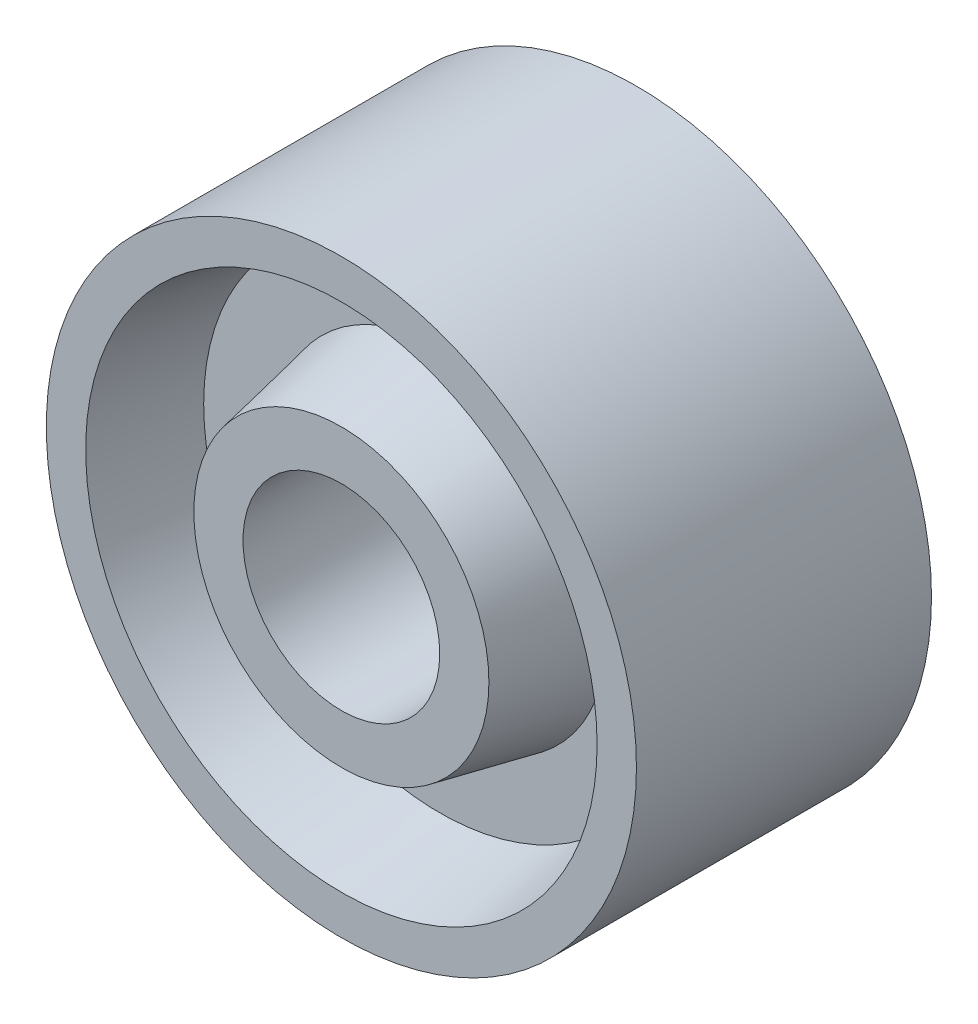
ISO-10303-21;
HEADER;
FILE_DESCRIPTION(('STEP AP214'),'2;1');
FILE_NAME('part.step','',(''),(''),'','','');
FILE_SCHEMA(('AUTOMOTIVE_DESIGN { 1 0 10303 214 1 1 1 1 }'));
ENDSEC;
DATA;
#1=APPLICATION_CONTEXT('core data for automotive mechanical design processes');
#2=APPLICATION_PROTOCOL_DEFINITION('international standard','automotive_design',2000,#1);
#3=PRODUCT_CONTEXT('',#1,'mechanical');
#4=PRODUCT('Part','Part','',(#3));
#5=PRODUCT_RELATED_PRODUCT_CATEGORY('part','',(#4));
#6=PRODUCT_DEFINITION_FORMATION('','',#4);
#7=PRODUCT_DEFINITION_CONTEXT('part definition',#1,'design');
#8=PRODUCT_DEFINITION('design','',#6,#7);
#9=PRODUCT_DEFINITION_SHAPE('','',#8);
#10=(LENGTH_UNIT() NAMED_UNIT(*) SI_UNIT(.MILLI.,.METRE.));
#11=(NAMED_UNIT(*) PLANE_ANGLE_UNIT() SI_UNIT($,.RADIAN.));
#12=(NAMED_UNIT(*) SI_UNIT($,.STERADIAN.) SOLID_ANGLE_UNIT());
#13=UNCERTAINTY_MEASURE_WITH_UNIT(LENGTH_MEASURE(1.E-05),#10,'distance_accuracy_value','');
#14=(GEOMETRIC_REPRESENTATION_CONTEXT(3) GLOBAL_UNCERTAINTY_ASSIGNED_CONTEXT((#13)) GLOBAL_UNIT_ASSIGNED_CONTEXT((#10,
#11,#12)) REPRESENTATION_CONTEXT('',''));
#15=CARTESIAN_POINT('',(0.,0.,0.));
#16=DIRECTION('',(0.,0.,1.));
#17=DIRECTION('',(1.,0.,0.));
#18=AXIS2_PLACEMENT_3D('',#15,#16,#17);
#19=CARTESIAN_POINT('',(0.,10.,-25.0704225352113));
#20=DIRECTION('',(0.,0.,1.));
#21=DIRECTION('',(1.,0.,0.));
#22=AXIS2_PLACEMENT_3D('',#19,#20,#21);
#23=PLANE('',#22);
#24=CARTESIAN_POINT('',(0.,0.,-25.0704225352113));
#25=DIRECTION('',(0.,0.,1.));
#26=DIRECTION('',(1.,0.,0.));
#27=AXIS2_PLACEMENT_3D('',#24,#25,#26);
#28=CIRCLE('',#27,15.);
#29=CARTESIAN_POINT('',(15.,0.,-25.0704225352113));
#30=VERTEX_POINT('',#29);
#31=EDGE_CURVE('E10',#30,#30,#28,.T.);
#32=ORIENTED_EDGE('',*,*,#31,.F.);
#33=EDGE_LOOP('',(#32));
#34=FACE_BOUND('',#33,.T.);
#35=CARTESIAN_POINT('',(0.,0.,-25.0704225352113));
#36=DIRECTION('',(0.,0.,1.));
#37=DIRECTION('',(1.,0.,0.));
#38=AXIS2_PLACEMENT_3D('',#35,#36,#37);
#39=CIRCLE('',#38,10.);
#40=CARTESIAN_POINT('',(10.,0.,-25.0704225352113));
#41=VERTEX_POINT('',#40);
#42=EDGE_CURVE('E94',#41,#41,#39,.T.);
#43=ORIENTED_EDGE('',*,*,#42,.T.);
#44=EDGE_LOOP('',(#43));
#45=FACE_BOUND('',#44,.T.);
#46=ADVANCED_FACE('F43',(#34,#45),#23,.F.);
#47=CARTESIAN_POINT('',(0.,0.,-25.0704225352113));
#48=DIRECTION('',(0.,0.,1.));
#49=DIRECTION('',(1.,0.,0.));
#50=AXIS2_PLACEMENT_3D('',#47,#48,#49);
#51=CONICAL_SURFACE('',#50,15.,0.197395559849881);
#52=CARTESIAN_POINT('',(0.,0.,-15.0704225352112));
#53=DIRECTION('',(0.,0.,1.));
#54=DIRECTION('',(1.,0.,0.));
#55=AXIS2_PLACEMENT_3D('',#52,#53,#54);
#56=CIRCLE('',#55,17.);
#57=CARTESIAN_POINT('',(17.,0.,-15.0704225352112));
#58=VERTEX_POINT('',#57);
#59=EDGE_CURVE('E50',#58,#58,#56,.T.);
#60=ORIENTED_EDGE('',*,*,#59,.F.);
#61=EDGE_LOOP('',(#60));
#62=FACE_BOUND('',#61,.T.);
#63=ORIENTED_EDGE('',*,*,#31,.T.);
#64=EDGE_LOOP('',(#63));
#65=FACE_BOUND('',#64,.T.);
#66=ADVANCED_FACE('F156',(#62,#65),#51,.T.);
#67=CARTESIAN_POINT('',(0.,17.,-15.0704225352112));
#68=DIRECTION('',(0.,0.,1.));
#69=DIRECTION('',(1.,0.,0.));
#70=AXIS2_PLACEMENT_3D('',#67,#68,#69);
#71=PLANE('',#70);
#72=CARTESIAN_POINT('',(0.,0.,-15.0704225352113));
#73=DIRECTION('',(0.,0.,1.));
#74=DIRECTION('',(1.,0.,0.));
#75=AXIS2_PLACEMENT_3D('',#72,#73,#74);
#76=CIRCLE('',#75,24.);
#77=CARTESIAN_POINT('',(24.,0.,-15.0704225352113));
#78=VERTEX_POINT('',#77);
#79=EDGE_CURVE('E55',#78,#78,#76,.T.);
#80=ORIENTED_EDGE('',*,*,#79,.F.);
#81=EDGE_LOOP('',(#80));
#82=FACE_BOUND('',#81,.T.);
#83=ORIENTED_EDGE('',*,*,#59,.T.);
#84=EDGE_LOOP('',(#83));
#85=FACE_BOUND('',#84,.T.);
#86=ADVANCED_FACE('F151',(#82,#85),#71,.F.);
#87=CARTESIAN_POINT('',(0.,0.,-15.0704225352113));
#88=DIRECTION('',(0.,0.,-1.));
#89=DIRECTION('',(-1.,0.,0.));
#90=AXIS2_PLACEMENT_3D('',#87,#88,#89);
#91=CONICAL_SURFACE('',#90,24.,0.197395559849881);
#92=CARTESIAN_POINT('',(0.,0.,-25.0704225352112));
#93=DIRECTION('',(0.,0.,1.));
#94=DIRECTION('',(1.,0.,0.));
#95=AXIS2_PLACEMENT_3D('',#92,#93,#94);
#96=CIRCLE('',#95,26.);
#97=CARTESIAN_POINT('',(26.,0.,-25.0704225352112));
#98=VERTEX_POINT('',#97);
#99=EDGE_CURVE('E60',#98,#98,#96,.T.);
#100=ORIENTED_EDGE('',*,*,#99,.F.);
#101=EDGE_LOOP('',(#100));
#102=FACE_BOUND('',#101,.T.);
#103=ORIENTED_EDGE('',*,*,#79,.T.);
#104=EDGE_LOOP('',(#103));
#105=FACE_BOUND('',#104,.T.);
#106=ADVANCED_FACE('F145',(#102,#105),#91,.F.);
#107=CARTESIAN_POINT('',(0.,26.,-25.0704225352112));
#108=DIRECTION('',(0.,0.,1.));
#109=DIRECTION('',(1.,0.,0.));
#110=AXIS2_PLACEMENT_3D('',#107,#108,#109);
#111=PLANE('',#110);
#112=CARTESIAN_POINT('',(0.,0.,-25.0704225352112));
#113=DIRECTION('',(0.,0.,1.));
#114=DIRECTION('',(1.,0.,0.));
#115=AXIS2_PLACEMENT_3D('',#112,#113,#114);
#116=CIRCLE('',#115,30.);
#117=CARTESIAN_POINT('',(30.,0.,-25.0704225352112));
#118=VERTEX_POINT('',#117);
#119=EDGE_CURVE('E66',#118,#118,#116,.T.);
#120=ORIENTED_EDGE('',*,*,#119,.F.);
#121=EDGE_LOOP('',(#120));
#122=FACE_BOUND('',#121,.T.);
#123=ORIENTED_EDGE('',*,*,#99,.T.);
#124=EDGE_LOOP('',(#123));
#125=FACE_BOUND('',#124,.T.);
#126=ADVANCED_FACE('F139',(#122,#125),#111,.F.);
#127=CARTESIAN_POINT('',(0.,0.,34.9295774647887));
#128=DIRECTION('',(0.,0.,1.));
#129=DIRECTION('',(1.,0.,0.));
#130=AXIS2_PLACEMENT_3D('',#127,#128,#129);
#131=CYLINDRICAL_SURFACE('',#130,30.);
#132=CARTESIAN_POINT('',(0.,0.,4.92957746478875));
#133=DIRECTION('',(0.,0.,1.));
#134=DIRECTION('',(1.,0.,0.));
#135=AXIS2_PLACEMENT_3D('',#132,#133,#134);
#136=CIRCLE('',#135,30.);
#137=CARTESIAN_POINT('',(30.,0.,4.92957746478875));
#138=VERTEX_POINT('',#137);
#139=EDGE_CURVE('E70',#138,#138,#136,.T.);
#140=ORIENTED_EDGE('',*,*,#139,.F.);
#141=EDGE_LOOP('',(#140));
#142=FACE_BOUND('',#141,.T.);
#143=ORIENTED_EDGE('',*,*,#119,.T.);
#144=EDGE_LOOP('',(#143));
#145=FACE_BOUND('',#144,.T.);
#146=ADVANCED_FACE('F133',(#142,#145),#131,.T.);
#147=CARTESIAN_POINT('',(0.,26.,4.92957746478875));
#148=DIRECTION('',(0.,0.,-1.));
#149=DIRECTION('',(-1.,0.,0.));
#150=AXIS2_PLACEMENT_3D('',#147,#148,#149);
#151=PLANE('',#150);
#152=CARTESIAN_POINT('',(0.,0.,4.92957746478875));
#153=DIRECTION('',(0.,0.,1.));
#154=DIRECTION('',(1.,0.,0.));
#155=AXIS2_PLACEMENT_3D('',#152,#153,#154);
#156=CIRCLE('',#155,26.);
#157=CARTESIAN_POINT('',(26.,0.,4.92957746478875));
#158=VERTEX_POINT('',#157);
#159=EDGE_CURVE('E74',#158,#158,#156,.T.);
#160=ORIENTED_EDGE('',*,*,#159,.F.);
#161=EDGE_LOOP('',(#160));
#162=FACE_BOUND('',#161,.T.);
#163=ORIENTED_EDGE('',*,*,#139,.T.);
#164=EDGE_LOOP('',(#163));
#165=FACE_BOUND('',#164,.T.);
#166=ADVANCED_FACE('F127',(#162,#165),#151,.F.);
#167=CARTESIAN_POINT('',(0.,0.,4.92957746478875));
#168=DIRECTION('',(0.,0.,1.));
#169=DIRECTION('',(1.,0.,0.));
#170=AXIS2_PLACEMENT_3D('',#167,#168,#169);
#171=CONICAL_SURFACE('',#170,26.,0.19739555984988);
#172=CARTESIAN_POINT('',(0.,0.,-5.07042253521125));
#173=DIRECTION('',(0.,0.,1.));
#174=DIRECTION('',(1.,0.,0.));
#175=AXIS2_PLACEMENT_3D('',#172,#173,#174);
#176=CIRCLE('',#175,24.);
#177=CARTESIAN_POINT('',(24.,0.,-5.07042253521125));
#178=VERTEX_POINT('',#177);
#179=EDGE_CURVE('E78',#178,#178,#176,.T.);
#180=ORIENTED_EDGE('',*,*,#179,.F.);
#181=EDGE_LOOP('',(#180));
#182=FACE_BOUND('',#181,.T.);
#183=ORIENTED_EDGE('',*,*,#159,.T.);
#184=EDGE_LOOP('',(#183));
#185=FACE_BOUND('',#184,.T.);
#186=ADVANCED_FACE('F121',(#182,#185),#171,.F.);
#187=CARTESIAN_POINT('',(0.,17.,-5.07042253521125));
#188=DIRECTION('',(0.,0.,-1.));
#189=DIRECTION('',(-1.,0.,0.));
#190=AXIS2_PLACEMENT_3D('',#187,#188,#189);
#191=PLANE('',#190);
#192=CARTESIAN_POINT('',(0.,0.,-5.07042253521125));
#193=DIRECTION('',(0.,0.,1.));
#194=DIRECTION('',(1.,0.,0.));
#195=AXIS2_PLACEMENT_3D('',#192,#193,#194);
#196=CIRCLE('',#195,17.);
#197=CARTESIAN_POINT('',(17.,0.,-5.07042253521125));
#198=VERTEX_POINT('',#197);
#199=EDGE_CURVE('E82',#198,#198,#196,.T.);
#200=ORIENTED_EDGE('',*,*,#199,.F.);
#201=EDGE_LOOP('',(#200));
#202=FACE_BOUND('',#201,.T.);
#203=ORIENTED_EDGE('',*,*,#179,.T.);
#204=EDGE_LOOP('',(#203));
#205=FACE_BOUND('',#204,.T.);
#206=ADVANCED_FACE('F115',(#202,#205),#191,.F.);
#207=CARTESIAN_POINT('',(0.,0.,-5.07042253521125));
#208=DIRECTION('',(0.,0.,-1.));
#209=DIRECTION('',(-1.,0.,0.));
#210=AXIS2_PLACEMENT_3D('',#207,#208,#209);
#211=CONICAL_SURFACE('',#210,17.,0.197395559849881);
#212=CARTESIAN_POINT('',(0.,0.,4.92957746478875));
#213=DIRECTION('',(0.,0.,1.));
#214=DIRECTION('',(1.,0.,0.));
#215=AXIS2_PLACEMENT_3D('',#212,#213,#214);
#216=CIRCLE('',#215,15.);
#217=CARTESIAN_POINT('',(15.,0.,4.92957746478875));
#218=VERTEX_POINT('',#217);
#219=EDGE_CURVE('E86',#218,#218,#216,.T.);
#220=ORIENTED_EDGE('',*,*,#219,.F.);
#221=EDGE_LOOP('',(#220));
#222=FACE_BOUND('',#221,.T.);
#223=ORIENTED_EDGE('',*,*,#199,.T.);
#224=EDGE_LOOP('',(#223));
#225=FACE_BOUND('',#224,.T.);
#226=ADVANCED_FACE('F109',(#222,#225),#211,.T.);
#227=CARTESIAN_POINT('',(0.,9.99999999999999,4.92957746478875));
#228=DIRECTION('',(0.,0.,-1.));
#229=DIRECTION('',(-1.,0.,0.));
#230=AXIS2_PLACEMENT_3D('',#227,#228,#229);
#231=PLANE('',#230);
#232=CARTESIAN_POINT('',(0.,0.,4.92957746478875));
#233=DIRECTION('',(0.,0.,1.));
#234=DIRECTION('',(1.,0.,0.));
#235=AXIS2_PLACEMENT_3D('',#232,#233,#234);
#236=CIRCLE('',#235,9.99999999999999);
#237=CARTESIAN_POINT('',(9.99999999999999,0.,4.92957746478875));
#238=VERTEX_POINT('',#237);
#239=EDGE_CURVE('E90',#238,#238,#236,.T.);
#240=ORIENTED_EDGE('',*,*,#239,.F.);
#241=EDGE_LOOP('',(#240));
#242=FACE_BOUND('',#241,.T.);
#243=ORIENTED_EDGE('',*,*,#219,.T.);
#244=EDGE_LOOP('',(#243));
#245=FACE_BOUND('',#244,.T.);
#246=ADVANCED_FACE('F103',(#242,#245),#231,.F.);
#247=CARTESIAN_POINT('',(0.,0.,34.9295774647887));
#248=DIRECTION('',(0.,0.,1.));
#249=DIRECTION('',(1.,0.,0.));
#250=AXIS2_PLACEMENT_3D('',#247,#248,#249);
#251=CYLINDRICAL_SURFACE('',#250,9.99999999999999);
#252=ORIENTED_EDGE('',*,*,#42,.F.);
#253=EDGE_LOOP('',(#252));
#254=FACE_BOUND('',#253,.T.);
#255=ORIENTED_EDGE('',*,*,#239,.T.);
#256=EDGE_LOOP('',(#255));
#257=FACE_BOUND('',#256,.T.);
#258=ADVANCED_FACE('F100',(#254,#257),#251,.F.);
#259=CLOSED_SHELL('',(#46,#66,#86,#106,#126,#146,#166,#186,#206,#226,#246,#258));
#260=MANIFOLD_SOLID_BREP('B2',#259);
#261=ADVANCED_BREP_SHAPE_REPRESENTATION('',(#18,#260),#14);
#262=SHAPE_DEFINITION_REPRESENTATION(#9,#261);
ENDSEC;
END-ISO-10303-21;
